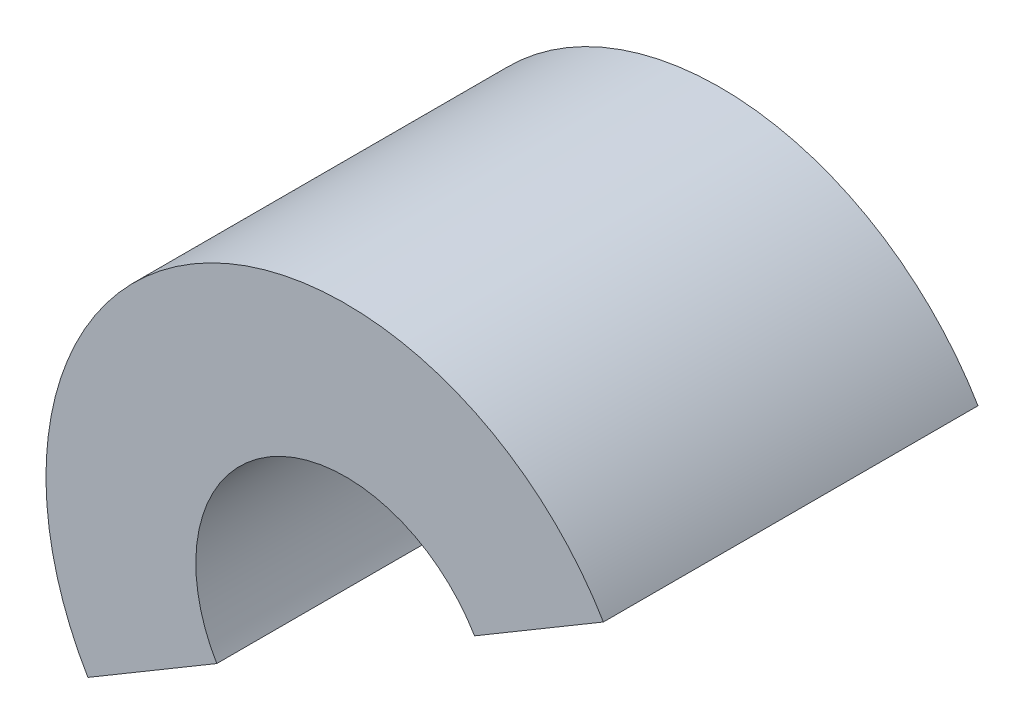
ISO-10303-21;
HEADER;
FILE_DESCRIPTION(('STEP AP214'),'2;1');
FILE_NAME('part.step','',(''),(''),'','','');
FILE_SCHEMA(('AUTOMOTIVE_DESIGN { 1 0 10303 214 1 1 1 1 }'));
ENDSEC;
DATA;
#1=APPLICATION_CONTEXT('core data for automotive mechanical design processes');
#2=APPLICATION_PROTOCOL_DEFINITION('international standard','automotive_design',2000,#1);
#3=PRODUCT_CONTEXT('',#1,'mechanical');
#4=PRODUCT('Part','Part','',(#3));
#5=PRODUCT_RELATED_PRODUCT_CATEGORY('part','',(#4));
#6=PRODUCT_DEFINITION_FORMATION('','',#4);
#7=PRODUCT_DEFINITION_CONTEXT('part definition',#1,'design');
#8=PRODUCT_DEFINITION('design','',#6,#7);
#9=PRODUCT_DEFINITION_SHAPE('','',#8);
#10=(LENGTH_UNIT() NAMED_UNIT(*) SI_UNIT(.MILLI.,.METRE.));
#11=(NAMED_UNIT(*) PLANE_ANGLE_UNIT() SI_UNIT($,.RADIAN.));
#12=(NAMED_UNIT(*) SI_UNIT($,.STERADIAN.) SOLID_ANGLE_UNIT());
#13=UNCERTAINTY_MEASURE_WITH_UNIT(LENGTH_MEASURE(1.E-05),#10,'distance_accuracy_value','');
#14=(GEOMETRIC_REPRESENTATION_CONTEXT(3) GLOBAL_UNCERTAINTY_ASSIGNED_CONTEXT((#13)) GLOBAL_UNIT_ASSIGNED_CONTEXT((#10,
#11,#12)) REPRESENTATION_CONTEXT('',''));
#15=CARTESIAN_POINT('',(0.,0.,0.));
#16=DIRECTION('',(0.,0.,1.));
#17=DIRECTION('',(1.,0.,0.));
#18=AXIS2_PLACEMENT_3D('',#15,#16,#17);
#19=CARTESIAN_POINT('',(0.,0.,25.));
#20=DIRECTION('',(-0.510113583171916,0.860107046979333,0.));
#21=DIRECTION('',(-0.860107046979333,-0.510113583171916,0.));
#22=AXIS2_PLACEMENT_3D('',#19,#20,#21);
#23=PLANE('',#22);
#24=DIRECTION('',(0.860107046979333,0.510113583171916,0.));
#25=VECTOR('',#24,1.);
#26=CARTESIAN_POINT('',(0.,0.,0.));
#27=LINE('',#26,#25);
#28=CARTESIAN_POINT('',(-17.2021409395867,-10.2022716634383,0.));
#29=VERTEX_POINT('',#28);
#30=CARTESIAN_POINT('',(-8.60107046979333,-5.10113583171916,0.));
#31=VERTEX_POINT('',#30);
#32=EDGE_CURVE('E96',#29,#31,#27,.T.);
#33=ORIENTED_EDGE('',*,*,#32,.T.);
#34=DIRECTION('',(0.,0.,-1.));
#35=VECTOR('',#34,1.);
#36=CARTESIAN_POINT('',(-8.60107046979333,-5.10113583171916,25.));
#37=LINE('',#36,#35);
#38=CARTESIAN_POINT('',(-8.60107046979333,-5.10113583171916,25.));
#39=VERTEX_POINT('',#38);
#40=EDGE_CURVE('E11',#39,#31,#37,.T.);
#41=ORIENTED_EDGE('',*,*,#40,.F.);
#42=DIRECTION('',(0.860107046979333,0.510113583171916,0.));
#43=VECTOR('',#42,1.);
#44=CARTESIAN_POINT('',(0.,0.,25.));
#45=LINE('',#44,#43);
#46=CARTESIAN_POINT('',(-17.2021409395867,-10.2022716634383,25.));
#47=VERTEX_POINT('',#46);
#48=EDGE_CURVE('E85',#47,#39,#45,.T.);
#49=ORIENTED_EDGE('',*,*,#48,.F.);
#50=DIRECTION('',(0.,0.,-1.));
#51=VECTOR('',#50,1.);
#52=CARTESIAN_POINT('',(-17.2021409395867,-10.2022716634383,25.));
#53=LINE('',#52,#51);
#54=EDGE_CURVE('E92',#47,#29,#53,.T.);
#55=ORIENTED_EDGE('',*,*,#54,.T.);
#56=EDGE_LOOP('',(#33,#41,#49,#55));
#57=FACE_BOUND('',#56,.T.);
#58=ADVANCED_FACE('F33',(#57),#23,.F.);
#59=CARTESIAN_POINT('',(0.,0.,25.));
#60=DIRECTION('',(0.,0.,-1.));
#61=DIRECTION('',(-1.,0.,0.));
#62=AXIS2_PLACEMENT_3D('',#59,#60,#61);
#63=CYLINDRICAL_SURFACE('',#62,10.);
#64=CARTESIAN_POINT('',(0.,0.,0.));
#65=DIRECTION('',(0.,0.,1.));
#66=DIRECTION('',(1.,0.,0.));
#67=AXIS2_PLACEMENT_3D('',#64,#65,#66);
#68=CIRCLE('',#67,10.);
#69=CARTESIAN_POINT('',(8.60107046979334,5.10113583171915,0.));
#70=VERTEX_POINT('',#69);
#71=EDGE_CURVE('E88',#31,#70,#68,.F.);
#72=ORIENTED_EDGE('',*,*,#71,.T.);
#73=DIRECTION('',(0.,0.,-1.));
#74=VECTOR('',#73,1.);
#75=CARTESIAN_POINT('',(8.60107046979334,5.10113583171915,25.));
#76=LINE('',#75,#74);
#77=CARTESIAN_POINT('',(8.60107046979334,5.10113583171915,25.));
#78=VERTEX_POINT('',#77);
#79=EDGE_CURVE('E42',#78,#70,#76,.T.);
#80=ORIENTED_EDGE('',*,*,#79,.F.);
#81=CARTESIAN_POINT('',(0.,0.,25.));
#82=DIRECTION('',(0.,0.,1.));
#83=DIRECTION('',(1.,0.,0.));
#84=AXIS2_PLACEMENT_3D('',#81,#82,#83);
#85=CIRCLE('',#84,10.);
#86=EDGE_CURVE('E80',#39,#78,#85,.F.);
#87=ORIENTED_EDGE('',*,*,#86,.F.);
#88=ORIENTED_EDGE('',*,*,#40,.T.);
#89=EDGE_LOOP('',(#72,#80,#87,#88));
#90=FACE_BOUND('',#89,.T.);
#91=ADVANCED_FACE('F35',(#90),#63,.F.);
#92=CARTESIAN_POINT('',(17.2021409395867,10.2022716634383,0.));
#93=VERTEX_POINT('',#92);
#94=EDGE_CURVE('E67',#70,#93,#27,.T.);
#95=ORIENTED_EDGE('',*,*,#94,.T.);
#96=DIRECTION('',(0.,0.,-1.));
#97=VECTOR('',#96,1.);
#98=CARTESIAN_POINT('',(17.2021409395867,10.2022716634383,25.));
#99=LINE('',#98,#97);
#100=CARTESIAN_POINT('',(17.2021409395867,10.2022716634383,25.));
#101=VERTEX_POINT('',#100);
#102=EDGE_CURVE('E89',#101,#93,#99,.T.);
#103=ORIENTED_EDGE('',*,*,#102,.F.);
#104=EDGE_CURVE('E83',#78,#101,#45,.T.);
#105=ORIENTED_EDGE('',*,*,#104,.F.);
#106=ORIENTED_EDGE('',*,*,#79,.T.);
#107=EDGE_LOOP('',(#95,#103,#105,#106));
#108=FACE_BOUND('',#107,.T.);
#109=ADVANCED_FACE('F90',(#108),#23,.F.);
#110=CARTESIAN_POINT('',(0.,0.,25.));
#111=DIRECTION('',(0.,0.,-1.));
#112=DIRECTION('',(-1.,0.,0.));
#113=AXIS2_PLACEMENT_3D('',#110,#111,#112);
#114=CYLINDRICAL_SURFACE('',#113,20.);
#115=CARTESIAN_POINT('',(0.,0.,0.));
#116=DIRECTION('',(0.,0.,1.));
#117=DIRECTION('',(1.,0.,0.));
#118=AXIS2_PLACEMENT_3D('',#115,#116,#117);
#119=CIRCLE('',#118,20.);
#120=EDGE_CURVE('E73',#93,#29,#119,.T.);
#121=ORIENTED_EDGE('',*,*,#120,.T.);
#122=ORIENTED_EDGE('',*,*,#54,.F.);
#123=CARTESIAN_POINT('',(0.,0.,25.));
#124=DIRECTION('',(0.,0.,1.));
#125=DIRECTION('',(1.,0.,0.));
#126=AXIS2_PLACEMENT_3D('',#123,#124,#125);
#127=CIRCLE('',#126,20.);
#128=EDGE_CURVE('E50',#101,#47,#127,.T.);
#129=ORIENTED_EDGE('',*,*,#128,.F.);
#130=ORIENTED_EDGE('',*,*,#102,.T.);
#131=EDGE_LOOP('',(#121,#122,#129,#130));
#132=FACE_BOUND('',#131,.T.);
#133=ADVANCED_FACE('F100',(#132),#114,.T.);
#134=CARTESIAN_POINT('',(0.,0.,25.));
#135=DIRECTION('',(0.,0.,1.));
#136=DIRECTION('',(1.,0.,0.));
#137=AXIS2_PLACEMENT_3D('',#134,#135,#136);
#138=PLANE('',#137);
#139=ORIENTED_EDGE('',*,*,#48,.T.);
#140=ORIENTED_EDGE('',*,*,#86,.T.);
#141=ORIENTED_EDGE('',*,*,#104,.T.);
#142=ORIENTED_EDGE('',*,*,#128,.T.);
#143=EDGE_LOOP('',(#139,#140,#141,#142));
#144=FACE_BOUND('',#143,.T.);
#145=ADVANCED_FACE('F81',(#144),#138,.T.);
#146=CARTESIAN_POINT('',(0.,0.,0.));
#147=DIRECTION('',(0.,0.,1.));
#148=DIRECTION('',(1.,0.,0.));
#149=AXIS2_PLACEMENT_3D('',#146,#147,#148);
#150=PLANE('',#149);
#151=ORIENTED_EDGE('',*,*,#32,.F.);
#152=ORIENTED_EDGE('',*,*,#120,.F.);
#153=ORIENTED_EDGE('',*,*,#94,.F.);
#154=ORIENTED_EDGE('',*,*,#71,.F.);
#155=EDGE_LOOP('',(#151,#152,#153,#154));
#156=FACE_BOUND('',#155,.T.);
#157=ADVANCED_FACE('F103',(#156),#150,.F.);
#158=CLOSED_SHELL('',(#58,#91,#109,#133,#145,#157));
#159=MANIFOLD_SOLID_BREP('B2',#158);
#160=ADVANCED_BREP_SHAPE_REPRESENTATION('',(#18,#159),#14);
#161=SHAPE_DEFINITION_REPRESENTATION(#9,#160);
ENDSEC;
END-ISO-10303-21;
